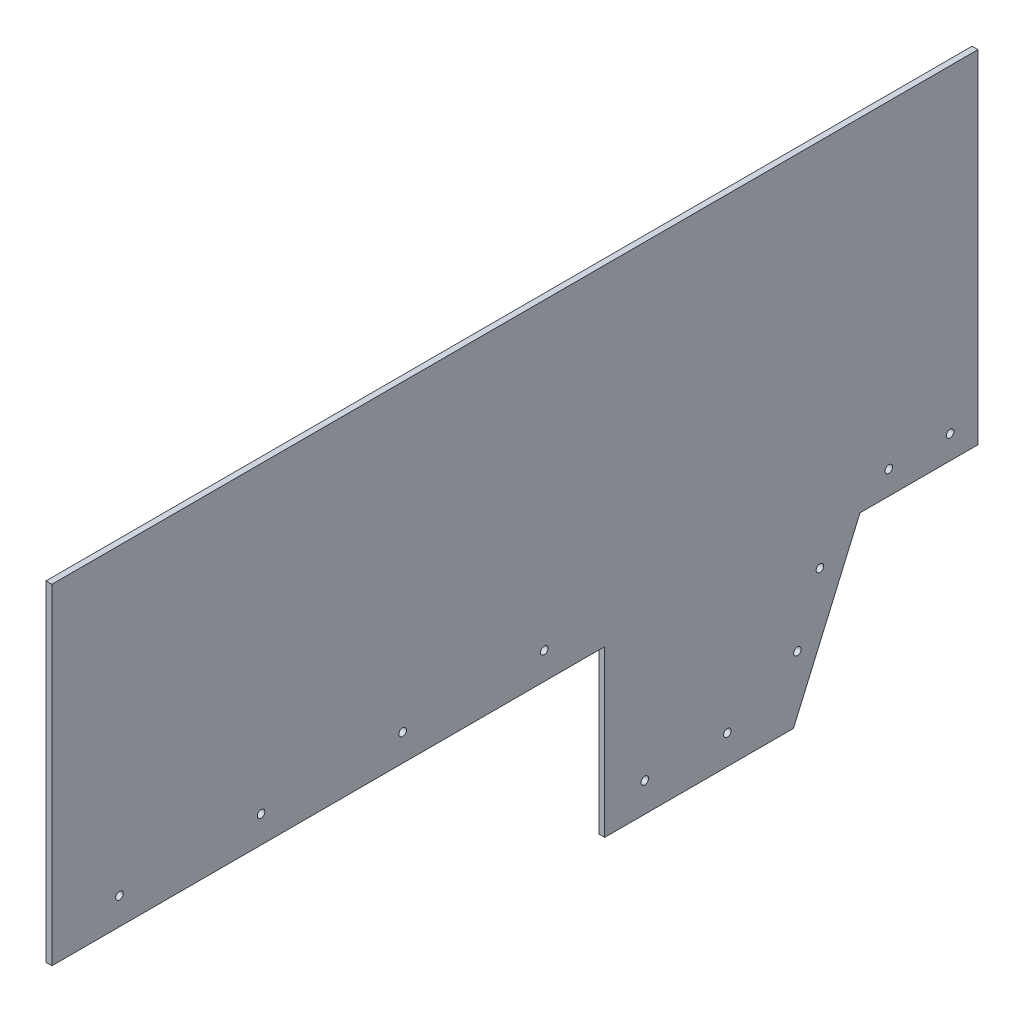
ISO-10303-21;
HEADER;
FILE_DESCRIPTION(('STEP AP214'),'2;1');
FILE_NAME('part.step','',(''),(''),'','','');
FILE_SCHEMA(('AUTOMOTIVE_DESIGN { 1 0 10303 214 1 1 1 1 }'));
ENDSEC;
DATA;
#1=APPLICATION_CONTEXT('core data for automotive mechanical design processes');
#2=APPLICATION_PROTOCOL_DEFINITION('international standard','automotive_design',2000,#1);
#3=PRODUCT_CONTEXT('',#1,'mechanical');
#4=PRODUCT('Part','Part','',(#3));
#5=PRODUCT_RELATED_PRODUCT_CATEGORY('part','',(#4));
#6=PRODUCT_DEFINITION_FORMATION('','',#4);
#7=PRODUCT_DEFINITION_CONTEXT('part definition',#1,'design');
#8=PRODUCT_DEFINITION('design','',#6,#7);
#9=PRODUCT_DEFINITION_SHAPE('','',#8);
#10=(LENGTH_UNIT() NAMED_UNIT(*) SI_UNIT(.MILLI.,.METRE.));
#11=(NAMED_UNIT(*) PLANE_ANGLE_UNIT() SI_UNIT($,.RADIAN.));
#12=(NAMED_UNIT(*) SI_UNIT($,.STERADIAN.) SOLID_ANGLE_UNIT());
#13=UNCERTAINTY_MEASURE_WITH_UNIT(LENGTH_MEASURE(1.E-05),#10,'distance_accuracy_value','');
#14=(GEOMETRIC_REPRESENTATION_CONTEXT(3) GLOBAL_UNCERTAINTY_ASSIGNED_CONTEXT((#13)) GLOBAL_UNIT_ASSIGNED_CONTEXT((#10,
#11,#12)) REPRESENTATION_CONTEXT('',''));
#15=CARTESIAN_POINT('',(0.,0.,0.));
#16=DIRECTION('',(0.,0.,1.));
#17=DIRECTION('',(1.,0.,0.));
#18=AXIS2_PLACEMENT_3D('',#15,#16,#17);
#19=CARTESIAN_POINT('',(-1.5875,-74.3634808239726,212.814599999999));
#20=DIRECTION('',(1.,0.,0.));
#21=DIRECTION('',(0.,0.,-1.));
#22=AXIS2_PLACEMENT_3D('',#19,#20,#21);
#23=CYLINDRICAL_SURFACE('',#22,2.025);
#24=CARTESIAN_POINT('',(-1.5875,-74.3634808239726,212.814599999999));
#25=DIRECTION('',(1.,0.,0.));
#26=DIRECTION('',(0.,0.,-1.));
#27=AXIS2_PLACEMENT_3D('',#24,#25,#26);
#28=CIRCLE('',#27,2.025);
#29=CARTESIAN_POINT('',(-1.5875,-74.3634808239726,210.789599999999));
#30=VERTEX_POINT('',#29);
#31=EDGE_CURVE('E49',#30,#30,#28,.T.);
#32=ORIENTED_EDGE('',*,*,#31,.F.);
#33=EDGE_LOOP('',(#32));
#34=FACE_BOUND('',#33,.T.);
#35=CARTESIAN_POINT('',(1.5875,-74.3634808239726,212.814599999999));
#36=DIRECTION('',(1.,0.,0.));
#37=DIRECTION('',(0.,0.,-1.));
#38=AXIS2_PLACEMENT_3D('',#35,#36,#37);
#39=CIRCLE('',#38,2.025);
#40=CARTESIAN_POINT('',(1.5875,-74.3634808239726,210.789599999999));
#41=VERTEX_POINT('',#40);
#42=EDGE_CURVE('E11',#41,#41,#39,.T.);
#43=ORIENTED_EDGE('',*,*,#42,.T.);
#44=EDGE_LOOP('',(#43));
#45=FACE_BOUND('',#44,.T.);
#46=ADVANCED_FACE('F41',(#34,#45),#23,.F.);
#47=CARTESIAN_POINT('',(-1.5875,-74.3634808239726,136.614599999999));
#48=DIRECTION('',(1.,0.,0.));
#49=DIRECTION('',(0.,0.,-1.));
#50=AXIS2_PLACEMENT_3D('',#47,#48,#49);
#51=CYLINDRICAL_SURFACE('',#50,2.025);
#52=CARTESIAN_POINT('',(-1.5875,-74.3634808239726,136.614599999999));
#53=DIRECTION('',(1.,0.,0.));
#54=DIRECTION('',(0.,0.,-1.));
#55=AXIS2_PLACEMENT_3D('',#52,#53,#54);
#56=CIRCLE('',#55,2.025);
#57=CARTESIAN_POINT('',(-1.5875,-74.3634808239726,134.589599999999));
#58=VERTEX_POINT('',#57);
#59=EDGE_CURVE('E207',#58,#58,#56,.T.);
#60=ORIENTED_EDGE('',*,*,#59,.F.);
#61=EDGE_LOOP('',(#60));
#62=FACE_BOUND('',#61,.T.);
#63=CARTESIAN_POINT('',(1.5875,-74.3634808239726,136.614599999999));
#64=DIRECTION('',(1.,0.,0.));
#65=DIRECTION('',(0.,0.,-1.));
#66=AXIS2_PLACEMENT_3D('',#63,#64,#65);
#67=CIRCLE('',#66,2.025);
#68=CARTESIAN_POINT('',(1.5875,-74.3634808239726,134.589599999999));
#69=VERTEX_POINT('',#68);
#70=EDGE_CURVE('E211',#69,#69,#67,.T.);
#71=ORIENTED_EDGE('',*,*,#70,.T.);
#72=EDGE_LOOP('',(#71));
#73=FACE_BOUND('',#72,.T.);
#74=ADVANCED_FACE('F221',(#62,#73),#51,.F.);
#75=CARTESIAN_POINT('',(1.5875,88.9,-249.174));
#76=DIRECTION('',(0.,0.,1.));
#77=DIRECTION('',(0.,-1.,0.));
#78=AXIS2_PLACEMENT_3D('',#75,#76,#77);
#79=PLANE('',#78);
#80=DIRECTION('',(0.,1.,0.));
#81=VECTOR('',#80,1.);
#82=CARTESIAN_POINT('',(-1.5875,88.9,-249.174));
#83=LINE('',#82,#81);
#84=CARTESIAN_POINT('',(-1.5875,-95.25,-249.174));
#85=VERTEX_POINT('',#84);
#86=CARTESIAN_POINT('',(-1.5875,88.9,-249.174));
#87=VERTEX_POINT('',#86);
#88=EDGE_CURVE('E166',#85,#87,#83,.T.);
#89=ORIENTED_EDGE('',*,*,#88,.T.);
#90=DIRECTION('',(-1.,0.,0.));
#91=VECTOR('',#90,1.);
#92=CARTESIAN_POINT('',(1.5875,88.9,-249.174));
#93=LINE('',#92,#91);
#94=CARTESIAN_POINT('',(1.5875,88.9,-249.174));
#95=VERTEX_POINT('',#94);
#96=EDGE_CURVE('E204',#95,#87,#93,.T.);
#97=ORIENTED_EDGE('',*,*,#96,.F.);
#98=DIRECTION('',(0.,1.,0.));
#99=VECTOR('',#98,1.);
#100=CARTESIAN_POINT('',(1.5875,88.9,-249.174));
#101=LINE('',#100,#99);
#102=CARTESIAN_POINT('',(1.5875,-95.25,-249.174));
#103=VERTEX_POINT('',#102);
#104=EDGE_CURVE('E177',#103,#95,#101,.T.);
#105=ORIENTED_EDGE('',*,*,#104,.F.);
#106=DIRECTION('',(1.,0.,0.));
#107=VECTOR('',#106,1.);
#108=CARTESIAN_POINT('',(-1.5875,-95.25,-249.174));
#109=LINE('',#108,#107);
#110=EDGE_CURVE('E167',#85,#103,#109,.T.);
#111=ORIENTED_EDGE('',*,*,#110,.F.);
#112=EDGE_LOOP('',(#89,#97,#105,#111));
#113=FACE_BOUND('',#112,.T.);
#114=ADVANCED_FACE('F249',(#113),#79,.F.);
#115=CARTESIAN_POINT('',(1.5875,88.9,249.174));
#116=DIRECTION('',(0.,-1.,0.));
#117=DIRECTION('',(0.,0.,-1.));
#118=AXIS2_PLACEMENT_3D('',#115,#116,#117);
#119=PLANE('',#118);
#120=DIRECTION('',(0.,0.,1.));
#121=VECTOR('',#120,1.);
#122=CARTESIAN_POINT('',(-1.5875,88.9,249.174));
#123=LINE('',#122,#121);
#124=CARTESIAN_POINT('',(-1.5875,88.9,249.174));
#125=VERTEX_POINT('',#124);
#126=EDGE_CURVE('E192',#87,#125,#123,.T.);
#127=ORIENTED_EDGE('',*,*,#126,.T.);
#128=DIRECTION('',(-1.,0.,0.));
#129=VECTOR('',#128,1.);
#130=CARTESIAN_POINT('',(1.5875,88.9,249.174));
#131=LINE('',#130,#129);
#132=CARTESIAN_POINT('',(1.5875,88.9,249.174));
#133=VERTEX_POINT('',#132);
#134=EDGE_CURVE('E201',#133,#125,#131,.T.);
#135=ORIENTED_EDGE('',*,*,#134,.F.);
#136=DIRECTION('',(0.,0.,1.));
#137=VECTOR('',#136,1.);
#138=CARTESIAN_POINT('',(1.5875,88.9,249.174));
#139=LINE('',#138,#137);
#140=EDGE_CURVE('E88',#95,#133,#139,.T.);
#141=ORIENTED_EDGE('',*,*,#140,.F.);
#142=ORIENTED_EDGE('',*,*,#96,.T.);
#143=EDGE_LOOP('',(#127,#135,#141,#142));
#144=FACE_BOUND('',#143,.T.);
#145=ADVANCED_FACE('F246',(#144),#119,.F.);
#146=CARTESIAN_POINT('',(1.5875,88.9,249.174));
#147=DIRECTION('',(0.,0.,-1.));
#148=DIRECTION('',(-1.,0.,0.));
#149=AXIS2_PLACEMENT_3D('',#146,#147,#148);
#150=PLANE('',#149);
#151=DIRECTION('',(0.,-1.,0.));
#152=VECTOR('',#151,1.);
#153=CARTESIAN_POINT('',(-1.5875,88.9,249.174));
#154=LINE('',#153,#152);
#155=CARTESIAN_POINT('',(-1.5875,-88.9,249.174));
#156=VERTEX_POINT('',#155);
#157=EDGE_CURVE('E82',#125,#156,#154,.T.);
#158=ORIENTED_EDGE('',*,*,#157,.T.);
#159=DIRECTION('',(-1.,0.,0.));
#160=VECTOR('',#159,1.);
#161=CARTESIAN_POINT('',(1.5875,-88.9,249.174));
#162=LINE('',#161,#160);
#163=CARTESIAN_POINT('',(1.5875,-88.9,249.174));
#164=VERTEX_POINT('',#163);
#165=EDGE_CURVE('E188',#164,#156,#162,.T.);
#166=ORIENTED_EDGE('',*,*,#165,.F.);
#167=DIRECTION('',(0.,-1.,0.));
#168=VECTOR('',#167,1.);
#169=CARTESIAN_POINT('',(1.5875,88.9,249.174));
#170=LINE('',#169,#168);
#171=EDGE_CURVE('E65',#133,#164,#170,.T.);
#172=ORIENTED_EDGE('',*,*,#171,.F.);
#173=ORIENTED_EDGE('',*,*,#134,.T.);
#174=EDGE_LOOP('',(#158,#166,#172,#173));
#175=FACE_BOUND('',#174,.T.);
#176=ADVANCED_FACE('F236',(#175),#150,.F.);
#177=CARTESIAN_POINT('',(1.5875,-88.9,249.174));
#178=DIRECTION('',(0.,1.,0.));
#179=DIRECTION('',(0.,0.,1.));
#180=AXIS2_PLACEMENT_3D('',#177,#178,#179);
#181=PLANE('',#180);
#182=DIRECTION('',(0.,0.,-1.));
#183=VECTOR('',#182,1.);
#184=CARTESIAN_POINT('',(-1.5875,-88.9,249.174));
#185=LINE('',#184,#183);
#186=CARTESIAN_POINT('',(-1.5875,-88.9,-48.2854000000016));
#187=VERTEX_POINT('',#186);
#188=EDGE_CURVE('E180',#156,#187,#185,.T.);
#189=ORIENTED_EDGE('',*,*,#188,.T.);
#190=DIRECTION('',(1.,0.,0.));
#191=VECTOR('',#190,1.);
#192=CARTESIAN_POINT('',(-1.5875,-88.9,-48.2854000000016));
#193=LINE('',#192,#191);
#194=CARTESIAN_POINT('',(1.5875,-88.9,-48.2854000000015));
#195=VERTEX_POINT('',#194);
#196=EDGE_CURVE('E141',#187,#195,#193,.T.);
#197=ORIENTED_EDGE('',*,*,#196,.T.);
#198=DIRECTION('',(0.,0.,-1.));
#199=VECTOR('',#198,1.);
#200=CARTESIAN_POINT('',(1.5875,-88.9,249.174));
#201=LINE('',#200,#199);
#202=EDGE_CURVE('E185',#164,#195,#201,.T.);
#203=ORIENTED_EDGE('',*,*,#202,.F.);
#204=ORIENTED_EDGE('',*,*,#165,.T.);
#205=EDGE_LOOP('',(#189,#197,#203,#204));
#206=FACE_BOUND('',#205,.T.);
#207=ADVANCED_FACE('F226',(#206),#181,.F.);
#208=CARTESIAN_POINT('',(1.5875,0.,0.));
#209=DIRECTION('',(1.,0.,0.));
#210=DIRECTION('',(0.,0.,-1.));
#211=AXIS2_PLACEMENT_3D('',#208,#209,#210);
#212=PLANE('',#211);
#213=CARTESIAN_POINT('',(1.5875,-82.55,-234.190653386183));
#214=DIRECTION('',(-1.,0.,0.));
#215=DIRECTION('',(0.,0.,1.));
#216=AXIS2_PLACEMENT_3D('',#213,#214,#215);
#217=CIRCLE('',#216,2.02500000000001);
#218=CARTESIAN_POINT('',(1.5875,-82.55,-232.165653386183));
#219=VERTEX_POINT('',#218);
#220=EDGE_CURVE('E435',#219,#219,#217,.T.);
#221=ORIENTED_EDGE('',*,*,#220,.T.);
#222=EDGE_LOOP('',(#221));
#223=FACE_BOUND('',#222,.T.);
#224=CARTESIAN_POINT('',(1.5875,-82.55,-201.170653386183));
#225=DIRECTION('',(-1.,0.,0.));
#226=DIRECTION('',(0.,0.,1.));
#227=AXIS2_PLACEMENT_3D('',#224,#225,#226);
#228=CIRCLE('',#227,2.02500000000001);
#229=CARTESIAN_POINT('',(1.5875,-82.55,-199.145653386183));
#230=VERTEX_POINT('',#229);
#231=EDGE_CURVE('E445',#230,#230,#228,.T.);
#232=ORIENTED_EDGE('',*,*,#231,.T.);
#233=EDGE_LOOP('',(#232));
#234=FACE_BOUND('',#233,.T.);
#235=CARTESIAN_POINT('',(1.5875,-110.224827622022,-164.117120252394));
#236=DIRECTION('',(-1.,0.,0.));
#237=DIRECTION('',(0.,0.,1.));
#238=AXIS2_PLACEMENT_3D('',#235,#236,#237);
#239=CIRCLE('',#238,2.02500000000001);
#240=CARTESIAN_POINT('',(1.5875,-110.224827622022,-162.092120252394));
#241=VERTEX_POINT('',#240);
#242=EDGE_CURVE('E453',#241,#241,#239,.T.);
#243=ORIENTED_EDGE('',*,*,#242,.T.);
#244=EDGE_LOOP('',(#243));
#245=FACE_BOUND('',#244,.T.);
#246=CARTESIAN_POINT('',(1.5875,-142.898934488863,-152.004725040339));
#247=DIRECTION('',(-1.,0.,0.));
#248=DIRECTION('',(0.,0.,1.));
#249=AXIS2_PLACEMENT_3D('',#246,#247,#248);
#250=CIRCLE('',#249,2.02500000000001);
#251=CARTESIAN_POINT('',(1.5875,-142.898934488863,-149.979725040339));
#252=VERTEX_POINT('',#251);
#253=EDGE_CURVE('E461',#252,#252,#250,.T.);
#254=ORIENTED_EDGE('',*,*,#253,.T.);
#255=EDGE_LOOP('',(#254));
#256=FACE_BOUND('',#255,.T.);
#257=CARTESIAN_POINT('',(1.5875,-162.052,-114.325400000002));
#258=DIRECTION('',(-1.,0.,0.));
#259=DIRECTION('',(0.,0.,1.));
#260=AXIS2_PLACEMENT_3D('',#257,#258,#259);
#261=CIRCLE('',#260,2.025);
#262=CARTESIAN_POINT('',(1.5875,-162.052,-112.300400000002));
#263=VERTEX_POINT('',#262);
#264=EDGE_CURVE('E469',#263,#263,#261,.T.);
#265=ORIENTED_EDGE('',*,*,#264,.T.);
#266=EDGE_LOOP('',(#265));
#267=FACE_BOUND('',#266,.T.);
#268=CARTESIAN_POINT('',(1.5875,-162.052,-69.8754000000016));
#269=DIRECTION('',(-1.,0.,0.));
#270=DIRECTION('',(0.,0.,1.));
#271=AXIS2_PLACEMENT_3D('',#268,#269,#270);
#272=CIRCLE('',#271,2.025);
#273=CARTESIAN_POINT('',(1.5875,-162.052,-67.8504000000016));
#274=VERTEX_POINT('',#273);
#275=EDGE_CURVE('E477',#274,#274,#272,.T.);
#276=ORIENTED_EDGE('',*,*,#275,.T.);
#277=EDGE_LOOP('',(#276));
#278=FACE_BOUND('',#277,.T.);
#279=CARTESIAN_POINT('',(1.5875,-74.3634808239726,60.4145999999986));
#280=DIRECTION('',(1.,0.,0.));
#281=DIRECTION('',(0.,0.,-1.));
#282=AXIS2_PLACEMENT_3D('',#279,#280,#281);
#283=CIRCLE('',#282,2.025);
#284=CARTESIAN_POINT('',(1.5875,-74.3634808239726,58.3895999999986));
#285=VERTEX_POINT('',#284);
#286=EDGE_CURVE('E488',#285,#285,#283,.T.);
#287=ORIENTED_EDGE('',*,*,#286,.F.);
#288=EDGE_LOOP('',(#287));
#289=FACE_BOUND('',#288,.T.);
#290=CARTESIAN_POINT('',(1.5875,-74.3634808239726,-15.7854000000014));
#291=DIRECTION('',(1.,0.,0.));
#292=DIRECTION('',(0.,0.,-1.));
#293=AXIS2_PLACEMENT_3D('',#290,#291,#292);
#294=CIRCLE('',#293,2.025);
#295=CARTESIAN_POINT('',(1.5875,-74.3634808239726,-17.8104000000014));
#296=VERTEX_POINT('',#295);
#297=EDGE_CURVE('E150',#296,#296,#294,.T.);
#298=ORIENTED_EDGE('',*,*,#297,.F.);
#299=EDGE_LOOP('',(#298));
#300=FACE_BOUND('',#299,.T.);
#301=ORIENTED_EDGE('',*,*,#104,.T.);
#302=ORIENTED_EDGE('',*,*,#140,.T.);
#303=ORIENTED_EDGE('',*,*,#171,.T.);
#304=ORIENTED_EDGE('',*,*,#202,.T.);
#305=DIRECTION('',(0.,1.,0.));
#306=VECTOR('',#305,1.);
#307=CARTESIAN_POINT('',(1.5875,0.,-48.2854000000016));
#308=LINE('',#307,#306);
#309=CARTESIAN_POINT('',(1.5875,-177.8,-48.2854000000016));
#310=VERTEX_POINT('',#309);
#311=EDGE_CURVE('E56',#310,#195,#308,.T.);
#312=ORIENTED_EDGE('',*,*,#311,.F.);
#313=DIRECTION('',(0.,0.,1.));
#314=VECTOR('',#313,1.);
#315=CARTESIAN_POINT('',(1.5875,-177.8,0.));
#316=LINE('',#315,#314);
#317=CARTESIAN_POINT('',(1.5875,-177.8,-149.885400000002));
#318=VERTEX_POINT('',#317);
#319=EDGE_CURVE('E135',#318,#310,#316,.T.);
#320=ORIENTED_EDGE('',*,*,#319,.F.);
#321=DIRECTION('',(0.,-0.917486950304308,0.397765880916528));
#322=VECTOR('',#321,1.);
#323=CARTESIAN_POINT('',(1.5875,-82.8310344075947,-191.05809923683));
#324=LINE('',#323,#322);
#325=CARTESIAN_POINT('',(1.5875,-95.25,-185.674));
#326=VERTEX_POINT('',#325);
#327=EDGE_CURVE('E147',#326,#318,#324,.T.);
#328=ORIENTED_EDGE('',*,*,#327,.F.);
#329=DIRECTION('',(0.,0.,1.));
#330=VECTOR('',#329,1.);
#331=CARTESIAN_POINT('',(1.5875,-95.2500000000001,0.));
#332=LINE('',#331,#330);
#333=EDGE_CURVE('E144',#103,#326,#332,.T.);
#334=ORIENTED_EDGE('',*,*,#333,.F.);
#335=EDGE_LOOP('',(#301,#302,#303,#304,#312,#320,#328,#334));
#336=FACE_BOUND('',#335,.T.);
#337=ORIENTED_EDGE('',*,*,#70,.F.);
#338=EDGE_LOOP('',(#337));
#339=FACE_BOUND('',#338,.T.);
#340=ORIENTED_EDGE('',*,*,#42,.F.);
#341=EDGE_LOOP('',(#340));
#342=FACE_BOUND('',#341,.T.);
#343=ADVANCED_FACE('F224',(#223,#234,#245,#256,#267,#278,#289,#300,#336,#339,#342),#212,.T.);
#344=CARTESIAN_POINT('',(-1.5875,0.,0.));
#345=DIRECTION('',(1.,0.,0.));
#346=DIRECTION('',(0.,0.,-1.));
#347=AXIS2_PLACEMENT_3D('',#344,#345,#346);
#348=PLANE('',#347);
#349=CARTESIAN_POINT('',(-1.5875,-82.55,-234.190653386183));
#350=DIRECTION('',(-1.,0.,0.));
#351=DIRECTION('',(0.,0.,1.));
#352=AXIS2_PLACEMENT_3D('',#349,#350,#351);
#353=CIRCLE('',#352,2.02500000000001);
#354=CARTESIAN_POINT('',(-1.5875,-82.55,-232.165653386183));
#355=VERTEX_POINT('',#354);
#356=EDGE_CURVE('E438',#355,#355,#353,.T.);
#357=ORIENTED_EDGE('',*,*,#356,.F.);
#358=EDGE_LOOP('',(#357));
#359=FACE_BOUND('',#358,.T.);
#360=CARTESIAN_POINT('',(-1.5875,-82.55,-201.170653386183));
#361=DIRECTION('',(-1.,0.,0.));
#362=DIRECTION('',(0.,0.,1.));
#363=AXIS2_PLACEMENT_3D('',#360,#361,#362);
#364=CIRCLE('',#363,2.02500000000001);
#365=CARTESIAN_POINT('',(-1.5875,-82.55,-199.145653386183));
#366=VERTEX_POINT('',#365);
#367=EDGE_CURVE('E442',#366,#366,#364,.T.);
#368=ORIENTED_EDGE('',*,*,#367,.F.);
#369=EDGE_LOOP('',(#368));
#370=FACE_BOUND('',#369,.T.);
#371=CARTESIAN_POINT('',(-1.5875,-110.224827622022,-164.117120252394));
#372=DIRECTION('',(-1.,0.,0.));
#373=DIRECTION('',(0.,0.,1.));
#374=AXIS2_PLACEMENT_3D('',#371,#372,#373);
#375=CIRCLE('',#374,2.02500000000001);
#376=CARTESIAN_POINT('',(-1.5875,-110.224827622022,-162.092120252394));
#377=VERTEX_POINT('',#376);
#378=EDGE_CURVE('E449',#377,#377,#375,.T.);
#379=ORIENTED_EDGE('',*,*,#378,.F.);
#380=EDGE_LOOP('',(#379));
#381=FACE_BOUND('',#380,.T.);
#382=CARTESIAN_POINT('',(-1.5875,-142.898934488863,-152.004725040339));
#383=DIRECTION('',(-1.,0.,0.));
#384=DIRECTION('',(0.,0.,1.));
#385=AXIS2_PLACEMENT_3D('',#382,#383,#384);
#386=CIRCLE('',#385,2.02500000000001);
#387=CARTESIAN_POINT('',(-1.5875,-142.898934488863,-149.979725040339));
#388=VERTEX_POINT('',#387);
#389=EDGE_CURVE('E457',#388,#388,#386,.T.);
#390=ORIENTED_EDGE('',*,*,#389,.F.);
#391=EDGE_LOOP('',(#390));
#392=FACE_BOUND('',#391,.T.);
#393=CARTESIAN_POINT('',(-1.5875,-162.052,-114.325400000002));
#394=DIRECTION('',(-1.,0.,0.));
#395=DIRECTION('',(0.,0.,1.));
#396=AXIS2_PLACEMENT_3D('',#393,#394,#395);
#397=CIRCLE('',#396,2.025);
#398=CARTESIAN_POINT('',(-1.5875,-162.052,-112.300400000002));
#399=VERTEX_POINT('',#398);
#400=EDGE_CURVE('E465',#399,#399,#397,.T.);
#401=ORIENTED_EDGE('',*,*,#400,.F.);
#402=EDGE_LOOP('',(#401));
#403=FACE_BOUND('',#402,.T.);
#404=CARTESIAN_POINT('',(-1.5875,-162.052,-69.8754000000016));
#405=DIRECTION('',(-1.,0.,0.));
#406=DIRECTION('',(0.,0.,1.));
#407=AXIS2_PLACEMENT_3D('',#404,#405,#406);
#408=CIRCLE('',#407,2.025);
#409=CARTESIAN_POINT('',(-1.5875,-162.052,-67.8504000000016));
#410=VERTEX_POINT('',#409);
#411=EDGE_CURVE('E473',#410,#410,#408,.T.);
#412=ORIENTED_EDGE('',*,*,#411,.F.);
#413=EDGE_LOOP('',(#412));
#414=FACE_BOUND('',#413,.T.);
#415=CARTESIAN_POINT('',(-1.5875,-74.3634808239726,60.4145999999986));
#416=DIRECTION('',(1.,0.,0.));
#417=DIRECTION('',(0.,0.,-1.));
#418=AXIS2_PLACEMENT_3D('',#415,#416,#417);
#419=CIRCLE('',#418,2.025);
#420=CARTESIAN_POINT('',(-1.5875,-74.3634808239726,58.3895999999986));
#421=VERTEX_POINT('',#420);
#422=EDGE_CURVE('E481',#421,#421,#419,.T.);
#423=ORIENTED_EDGE('',*,*,#422,.T.);
#424=EDGE_LOOP('',(#423));
#425=FACE_BOUND('',#424,.T.);
#426=CARTESIAN_POINT('',(-1.5875,-74.3634808239726,-15.7854000000014));
#427=DIRECTION('',(1.,0.,0.));
#428=DIRECTION('',(0.,0.,-1.));
#429=AXIS2_PLACEMENT_3D('',#426,#427,#428);
#430=CIRCLE('',#429,2.025);
#431=CARTESIAN_POINT('',(-1.5875,-74.3634808239726,-17.8104000000014));
#432=VERTEX_POINT('',#431);
#433=EDGE_CURVE('E159',#432,#432,#430,.T.);
#434=ORIENTED_EDGE('',*,*,#433,.T.);
#435=EDGE_LOOP('',(#434));
#436=FACE_BOUND('',#435,.T.);
#437=ORIENTED_EDGE('',*,*,#88,.F.);
#438=DIRECTION('',(0.,0.,1.));
#439=VECTOR('',#438,1.);
#440=CARTESIAN_POINT('',(-1.5875,-95.2500000000001,0.));
#441=LINE('',#440,#439);
#442=CARTESIAN_POINT('',(-1.5875,-95.25,-185.674));
#443=VERTEX_POINT('',#442);
#444=EDGE_CURVE('E138',#85,#443,#441,.T.);
#445=ORIENTED_EDGE('',*,*,#444,.T.);
#446=DIRECTION('',(0.,-0.917486950304308,0.397765880916528));
#447=VECTOR('',#446,1.);
#448=CARTESIAN_POINT('',(-1.5875,-82.8310344075947,-191.05809923683));
#449=LINE('',#448,#447);
#450=CARTESIAN_POINT('',(-1.5875,-177.8,-149.885400000002));
#451=VERTEX_POINT('',#450);
#452=EDGE_CURVE('E126',#443,#451,#449,.T.);
#453=ORIENTED_EDGE('',*,*,#452,.T.);
#454=DIRECTION('',(0.,0.,1.));
#455=VECTOR('',#454,1.);
#456=CARTESIAN_POINT('',(-1.5875,-177.8,0.));
#457=LINE('',#456,#455);
#458=CARTESIAN_POINT('',(-1.5875,-177.8,-48.2854000000016));
#459=VERTEX_POINT('',#458);
#460=EDGE_CURVE('E118',#451,#459,#457,.T.);
#461=ORIENTED_EDGE('',*,*,#460,.T.);
#462=DIRECTION('',(0.,1.,0.));
#463=VECTOR('',#462,1.);
#464=CARTESIAN_POINT('',(-1.5875,0.,-48.2854000000016));
#465=LINE('',#464,#463);
#466=EDGE_CURVE('E124',#459,#187,#465,.T.);
#467=ORIENTED_EDGE('',*,*,#466,.T.);
#468=ORIENTED_EDGE('',*,*,#188,.F.);
#469=ORIENTED_EDGE('',*,*,#157,.F.);
#470=ORIENTED_EDGE('',*,*,#126,.F.);
#471=EDGE_LOOP('',(#437,#445,#453,#461,#467,#468,#469,#470));
#472=FACE_BOUND('',#471,.T.);
#473=ORIENTED_EDGE('',*,*,#59,.T.);
#474=EDGE_LOOP('',(#473));
#475=FACE_BOUND('',#474,.T.);
#476=ORIENTED_EDGE('',*,*,#31,.T.);
#477=EDGE_LOOP('',(#476));
#478=FACE_BOUND('',#477,.T.);
#479=ADVANCED_FACE('F120',(#359,#370,#381,#392,#403,#414,#425,#436,#472,#475,#478),#348,.F.);
#480=CARTESIAN_POINT('',(-1.5875,0.,-48.2854000000016));
#481=DIRECTION('',(0.,0.,-1.));
#482=DIRECTION('',(0.,1.,0.));
#483=AXIS2_PLACEMENT_3D('',#480,#481,#482);
#484=PLANE('',#483);
#485=ORIENTED_EDGE('',*,*,#311,.T.);
#486=ORIENTED_EDGE('',*,*,#196,.F.);
#487=ORIENTED_EDGE('',*,*,#466,.F.);
#488=DIRECTION('',(1.,0.,0.));
#489=VECTOR('',#488,1.);
#490=CARTESIAN_POINT('',(-1.5875,-177.8,-48.2854000000016));
#491=LINE('',#490,#489);
#492=EDGE_CURVE('E132',#459,#310,#491,.T.);
#493=ORIENTED_EDGE('',*,*,#492,.T.);
#494=EDGE_LOOP('',(#485,#486,#487,#493));
#495=FACE_BOUND('',#494,.T.);
#496=ADVANCED_FACE('F140',(#495),#484,.F.);
#497=CARTESIAN_POINT('',(-1.5875,-95.2500000000001,0.));
#498=DIRECTION('',(0.,1.,0.));
#499=DIRECTION('',(0.,0.,1.));
#500=AXIS2_PLACEMENT_3D('',#497,#498,#499);
#501=PLANE('',#500);
#502=ORIENTED_EDGE('',*,*,#333,.T.);
#503=DIRECTION('',(1.,0.,0.));
#504=VECTOR('',#503,1.);
#505=CARTESIAN_POINT('',(-1.5875,-95.25,-185.674));
#506=LINE('',#505,#504);
#507=EDGE_CURVE('E171',#443,#326,#506,.T.);
#508=ORIENTED_EDGE('',*,*,#507,.F.);
#509=ORIENTED_EDGE('',*,*,#444,.F.);
#510=ORIENTED_EDGE('',*,*,#110,.T.);
#511=EDGE_LOOP('',(#502,#508,#509,#510));
#512=FACE_BOUND('',#511,.T.);
#513=ADVANCED_FACE('F345',(#512),#501,.F.);
#514=CARTESIAN_POINT('',(-1.5875,-82.8310344075947,-191.05809923683));
#515=DIRECTION('',(0.,0.397765880916528,0.917486950304307));
#516=DIRECTION('',(0.,-0.917486950304307,0.397765880916528));
#517=AXIS2_PLACEMENT_3D('',#514,#515,#516);
#518=PLANE('',#517);
#519=ORIENTED_EDGE('',*,*,#327,.T.);
#520=DIRECTION('',(1.,0.,0.));
#521=VECTOR('',#520,1.);
#522=CARTESIAN_POINT('',(-1.5875,-177.8,-149.885400000002));
#523=LINE('',#522,#521);
#524=EDGE_CURVE('E137',#451,#318,#523,.T.);
#525=ORIENTED_EDGE('',*,*,#524,.F.);
#526=ORIENTED_EDGE('',*,*,#452,.F.);
#527=ORIENTED_EDGE('',*,*,#507,.T.);
#528=EDGE_LOOP('',(#519,#525,#526,#527));
#529=FACE_BOUND('',#528,.T.);
#530=ADVANCED_FACE('F350',(#529),#518,.F.);
#531=CARTESIAN_POINT('',(-1.5875,-177.8,0.));
#532=DIRECTION('',(0.,1.,0.));
#533=DIRECTION('',(0.,0.,1.));
#534=AXIS2_PLACEMENT_3D('',#531,#532,#533);
#535=PLANE('',#534);
#536=ORIENTED_EDGE('',*,*,#319,.T.);
#537=ORIENTED_EDGE('',*,*,#492,.F.);
#538=ORIENTED_EDGE('',*,*,#460,.F.);
#539=ORIENTED_EDGE('',*,*,#524,.T.);
#540=EDGE_LOOP('',(#536,#537,#538,#539));
#541=FACE_BOUND('',#540,.T.);
#542=ADVANCED_FACE('F133',(#541),#535,.F.);
#543=CARTESIAN_POINT('',(-1.5875,-74.3634808239726,-15.7854000000014));
#544=DIRECTION('',(1.,0.,0.));
#545=DIRECTION('',(0.,0.,-1.));
#546=AXIS2_PLACEMENT_3D('',#543,#544,#545);
#547=CYLINDRICAL_SURFACE('',#546,2.025);
#548=ORIENTED_EDGE('',*,*,#433,.F.);
#549=EDGE_LOOP('',(#548));
#550=FACE_BOUND('',#549,.T.);
#551=ORIENTED_EDGE('',*,*,#297,.T.);
#552=EDGE_LOOP('',(#551));
#553=FACE_BOUND('',#552,.T.);
#554=ADVANCED_FACE('F267',(#550,#553),#547,.F.);
#555=CARTESIAN_POINT('',(-1.5875,-74.3634808239726,60.4145999999986));
#556=DIRECTION('',(1.,0.,0.));
#557=DIRECTION('',(0.,0.,-1.));
#558=AXIS2_PLACEMENT_3D('',#555,#556,#557);
#559=CYLINDRICAL_SURFACE('',#558,2.025);
#560=ORIENTED_EDGE('',*,*,#422,.F.);
#561=EDGE_LOOP('',(#560));
#562=FACE_BOUND('',#561,.T.);
#563=ORIENTED_EDGE('',*,*,#286,.T.);
#564=EDGE_LOOP('',(#563));
#565=FACE_BOUND('',#564,.T.);
#566=ADVANCED_FACE('F271',(#562,#565),#559,.F.);
#567=CARTESIAN_POINT('',(1.5875,-162.052,-69.8754000000016));
#568=DIRECTION('',(-1.,0.,0.));
#569=DIRECTION('',(0.,0.,1.));
#570=AXIS2_PLACEMENT_3D('',#567,#568,#569);
#571=CYLINDRICAL_SURFACE('',#570,2.025);
#572=ORIENTED_EDGE('',*,*,#275,.F.);
#573=EDGE_LOOP('',(#572));
#574=FACE_BOUND('',#573,.T.);
#575=ORIENTED_EDGE('',*,*,#411,.T.);
#576=EDGE_LOOP('',(#575));
#577=FACE_BOUND('',#576,.T.);
#578=ADVANCED_FACE('F279',(#574,#577),#571,.F.);
#579=CARTESIAN_POINT('',(1.5875,-162.052,-114.325400000002));
#580=DIRECTION('',(-1.,0.,0.));
#581=DIRECTION('',(0.,0.,1.));
#582=AXIS2_PLACEMENT_3D('',#579,#580,#581);
#583=CYLINDRICAL_SURFACE('',#582,2.025);
#584=ORIENTED_EDGE('',*,*,#264,.F.);
#585=EDGE_LOOP('',(#584));
#586=FACE_BOUND('',#585,.T.);
#587=ORIENTED_EDGE('',*,*,#400,.T.);
#588=EDGE_LOOP('',(#587));
#589=FACE_BOUND('',#588,.T.);
#590=ADVANCED_FACE('F287',(#586,#589),#583,.F.);
#591=CARTESIAN_POINT('',(1.5875,-142.898934488863,-152.004725040339));
#592=DIRECTION('',(-1.,0.,0.));
#593=DIRECTION('',(0.,0.,1.));
#594=AXIS2_PLACEMENT_3D('',#591,#592,#593);
#595=CYLINDRICAL_SURFACE('',#594,2.02500000000001);
#596=ORIENTED_EDGE('',*,*,#253,.F.);
#597=EDGE_LOOP('',(#596));
#598=FACE_BOUND('',#597,.T.);
#599=ORIENTED_EDGE('',*,*,#389,.T.);
#600=EDGE_LOOP('',(#599));
#601=FACE_BOUND('',#600,.T.);
#602=ADVANCED_FACE('F295',(#598,#601),#595,.F.);
#603=CARTESIAN_POINT('',(1.5875,-110.224827622022,-164.117120252394));
#604=DIRECTION('',(-1.,0.,0.));
#605=DIRECTION('',(0.,0.,1.));
#606=AXIS2_PLACEMENT_3D('',#603,#604,#605);
#607=CYLINDRICAL_SURFACE('',#606,2.02500000000001);
#608=ORIENTED_EDGE('',*,*,#242,.F.);
#609=EDGE_LOOP('',(#608));
#610=FACE_BOUND('',#609,.T.);
#611=ORIENTED_EDGE('',*,*,#378,.T.);
#612=EDGE_LOOP('',(#611));
#613=FACE_BOUND('',#612,.T.);
#614=ADVANCED_FACE('F303',(#610,#613),#607,.F.);
#615=CARTESIAN_POINT('',(1.5875,-82.55,-201.170653386183));
#616=DIRECTION('',(-1.,0.,0.));
#617=DIRECTION('',(0.,0.,1.));
#618=AXIS2_PLACEMENT_3D('',#615,#616,#617);
#619=CYLINDRICAL_SURFACE('',#618,2.02500000000001);
#620=ORIENTED_EDGE('',*,*,#231,.F.);
#621=EDGE_LOOP('',(#620));
#622=FACE_BOUND('',#621,.T.);
#623=ORIENTED_EDGE('',*,*,#367,.T.);
#624=EDGE_LOOP('',(#623));
#625=FACE_BOUND('',#624,.T.);
#626=ADVANCED_FACE('F311',(#622,#625),#619,.F.);
#627=CARTESIAN_POINT('',(1.5875,-82.55,-234.190653386183));
#628=DIRECTION('',(-1.,0.,0.));
#629=DIRECTION('',(0.,0.,1.));
#630=AXIS2_PLACEMENT_3D('',#627,#628,#629);
#631=CYLINDRICAL_SURFACE('',#630,2.02500000000001);
#632=ORIENTED_EDGE('',*,*,#220,.F.);
#633=EDGE_LOOP('',(#632));
#634=FACE_BOUND('',#633,.T.);
#635=ORIENTED_EDGE('',*,*,#356,.T.);
#636=EDGE_LOOP('',(#635));
#637=FACE_BOUND('',#636,.T.);
#638=ADVANCED_FACE('F318',(#634,#637),#631,.F.);
#639=CLOSED_SHELL('',(#46,#74,#114,#145,#176,#207,#343,#479,#496,#513,#530,#542,#554,#566,#578,
#590,#602,#614,#626,#638));
#640=MANIFOLD_SOLID_BREP('B2',#639);
#641=ADVANCED_BREP_SHAPE_REPRESENTATION('',(#18,#640),#14);
#642=SHAPE_DEFINITION_REPRESENTATION(#9,#641);
ENDSEC;
END-ISO-10303-21;
